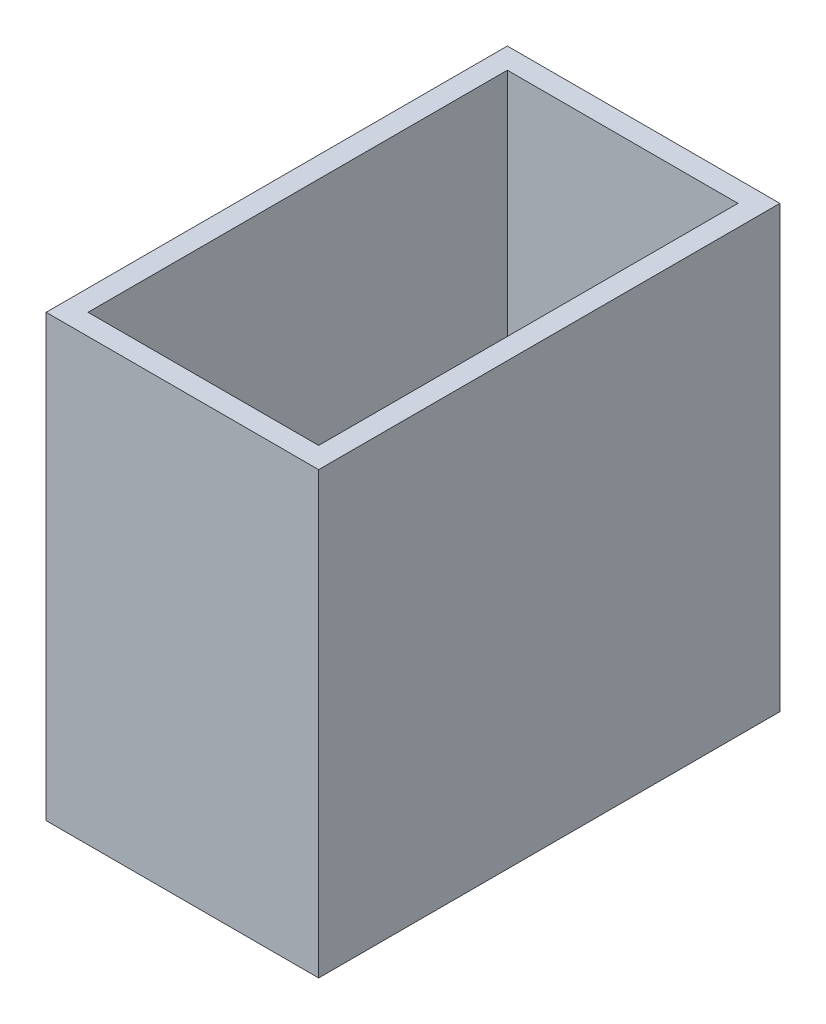
ISO-10303-21;
HEADER;
FILE_DESCRIPTION(('STEP AP214'),'2;1');
FILE_NAME('part.step','',(''),(''),'','','');
FILE_SCHEMA(('AUTOMOTIVE_DESIGN { 1 0 10303 214 1 1 1 1 }'));
ENDSEC;
DATA;
#1=APPLICATION_CONTEXT('core data for automotive mechanical design processes');
#2=APPLICATION_PROTOCOL_DEFINITION('international standard','automotive_design',2000,#1);
#3=PRODUCT_CONTEXT('',#1,'mechanical');
#4=PRODUCT('Part','Part','',(#3));
#5=PRODUCT_RELATED_PRODUCT_CATEGORY('part','',(#4));
#6=PRODUCT_DEFINITION_FORMATION('','',#4);
#7=PRODUCT_DEFINITION_CONTEXT('part definition',#1,'design');
#8=PRODUCT_DEFINITION('design','',#6,#7);
#9=PRODUCT_DEFINITION_SHAPE('','',#8);
#10=(LENGTH_UNIT() NAMED_UNIT(*) SI_UNIT(.MILLI.,.METRE.));
#11=(NAMED_UNIT(*) PLANE_ANGLE_UNIT() SI_UNIT($,.RADIAN.));
#12=(NAMED_UNIT(*) SI_UNIT($,.STERADIAN.) SOLID_ANGLE_UNIT());
#13=UNCERTAINTY_MEASURE_WITH_UNIT(LENGTH_MEASURE(1.E-05),#10,'distance_accuracy_value','');
#14=(GEOMETRIC_REPRESENTATION_CONTEXT(3) GLOBAL_UNCERTAINTY_ASSIGNED_CONTEXT((#13)) GLOBAL_UNIT_ASSIGNED_CONTEXT((#10,
#11,#12)) REPRESENTATION_CONTEXT('',''));
#15=CARTESIAN_POINT('',(0.,0.,0.));
#16=DIRECTION('',(0.,0.,1.));
#17=DIRECTION('',(1.,0.,0.));
#18=AXIS2_PLACEMENT_3D('',#15,#16,#17);
#19=CARTESIAN_POINT('',(-13.,2.,-22.));
#20=DIRECTION('',(1.,0.,0.));
#21=DIRECTION('',(0.,0.,-1.));
#22=AXIS2_PLACEMENT_3D('',#19,#20,#21);
#23=PLANE('',#22);
#24=DIRECTION('',(0.,0.,1.));
#25=VECTOR('',#24,1.);
#26=CARTESIAN_POINT('',(-13.,0.,-22.));
#27=LINE('',#26,#25);
#28=CARTESIAN_POINT('',(-13.,0.,-22.));
#29=VERTEX_POINT('',#28);
#30=CARTESIAN_POINT('',(-13.,0.,22.));
#31=VERTEX_POINT('',#30);
#32=EDGE_CURVE('E150',#29,#31,#27,.T.);
#33=ORIENTED_EDGE('',*,*,#32,.T.);
#34=DIRECTION('',(0.,-1.,0.));
#35=VECTOR('',#34,1.);
#36=CARTESIAN_POINT('',(-13.,2.,22.));
#37=LINE('',#36,#35);
#38=CARTESIAN_POINT('',(-13.,42.,22.));
#39=VERTEX_POINT('',#38);
#40=EDGE_CURVE('E11',#39,#31,#37,.T.);
#41=ORIENTED_EDGE('',*,*,#40,.F.);
#42=DIRECTION('',(0.,0.,1.));
#43=VECTOR('',#42,1.);
#44=CARTESIAN_POINT('',(-13.,42.,22.));
#45=LINE('',#44,#43);
#46=CARTESIAN_POINT('',(-13.,42.,-22.));
#47=VERTEX_POINT('',#46);
#48=EDGE_CURVE('E115',#47,#39,#45,.T.);
#49=ORIENTED_EDGE('',*,*,#48,.F.);
#50=DIRECTION('',(0.,-1.,0.));
#51=VECTOR('',#50,1.);
#52=CARTESIAN_POINT('',(-13.,2.,-22.));
#53=LINE('',#52,#51);
#54=EDGE_CURVE('E158',#47,#29,#53,.T.);
#55=ORIENTED_EDGE('',*,*,#54,.T.);
#56=EDGE_LOOP('',(#33,#41,#49,#55));
#57=FACE_BOUND('',#56,.T.);
#58=ADVANCED_FACE('F33',(#57),#23,.F.);
#59=CARTESIAN_POINT('',(13.,2.,22.));
#60=DIRECTION('',(0.,0.,-1.));
#61=DIRECTION('',(-1.,0.,0.));
#62=AXIS2_PLACEMENT_3D('',#59,#60,#61);
#63=PLANE('',#62);
#64=DIRECTION('',(1.,0.,0.));
#65=VECTOR('',#64,1.);
#66=CARTESIAN_POINT('',(13.,0.,22.));
#67=LINE('',#66,#65);
#68=CARTESIAN_POINT('',(13.,0.,22.));
#69=VERTEX_POINT('',#68);
#70=EDGE_CURVE('E153',#31,#69,#67,.T.);
#71=ORIENTED_EDGE('',*,*,#70,.T.);
#72=DIRECTION('',(0.,-1.,0.));
#73=VECTOR('',#72,1.);
#74=CARTESIAN_POINT('',(13.,2.,22.));
#75=LINE('',#74,#73);
#76=CARTESIAN_POINT('',(13.,42.,22.));
#77=VERTEX_POINT('',#76);
#78=EDGE_CURVE('E40',#77,#69,#75,.T.);
#79=ORIENTED_EDGE('',*,*,#78,.F.);
#80=DIRECTION('',(1.,0.,0.));
#81=VECTOR('',#80,1.);
#82=CARTESIAN_POINT('',(13.,42.,22.));
#83=LINE('',#82,#81);
#84=EDGE_CURVE('E141',#39,#77,#83,.T.);
#85=ORIENTED_EDGE('',*,*,#84,.F.);
#86=ORIENTED_EDGE('',*,*,#40,.T.);
#87=EDGE_LOOP('',(#71,#79,#85,#86));
#88=FACE_BOUND('',#87,.T.);
#89=ADVANCED_FACE('F176',(#88),#63,.F.);
#90=CARTESIAN_POINT('',(13.,2.,-22.));
#91=DIRECTION('',(-1.,0.,0.));
#92=DIRECTION('',(0.,0.,1.));
#93=AXIS2_PLACEMENT_3D('',#90,#91,#92);
#94=PLANE('',#93);
#95=DIRECTION('',(0.,0.,-1.));
#96=VECTOR('',#95,1.);
#97=CARTESIAN_POINT('',(13.,0.,-22.));
#98=LINE('',#97,#96);
#99=CARTESIAN_POINT('',(13.,0.,-22.));
#100=VERTEX_POINT('',#99);
#101=EDGE_CURVE('E155',#69,#100,#98,.T.);
#102=ORIENTED_EDGE('',*,*,#101,.T.);
#103=DIRECTION('',(0.,-1.,0.));
#104=VECTOR('',#103,1.);
#105=CARTESIAN_POINT('',(13.,2.,-22.));
#106=LINE('',#105,#104);
#107=CARTESIAN_POINT('',(13.,42.,-22.));
#108=VERTEX_POINT('',#107);
#109=EDGE_CURVE('E160',#108,#100,#106,.T.);
#110=ORIENTED_EDGE('',*,*,#109,.F.);
#111=DIRECTION('',(0.,0.,-1.));
#112=VECTOR('',#111,1.);
#113=CARTESIAN_POINT('',(13.,42.,22.));
#114=LINE('',#113,#112);
#115=EDGE_CURVE('E144',#77,#108,#114,.T.);
#116=ORIENTED_EDGE('',*,*,#115,.F.);
#117=ORIENTED_EDGE('',*,*,#78,.T.);
#118=EDGE_LOOP('',(#102,#110,#116,#117));
#119=FACE_BOUND('',#118,.T.);
#120=ADVANCED_FACE('F165',(#119),#94,.F.);
#121=CARTESIAN_POINT('',(13.,2.,-22.));
#122=DIRECTION('',(0.,0.,1.));
#123=DIRECTION('',(1.,0.,0.));
#124=AXIS2_PLACEMENT_3D('',#121,#122,#123);
#125=PLANE('',#124);
#126=DIRECTION('',(-1.,0.,0.));
#127=VECTOR('',#126,1.);
#128=CARTESIAN_POINT('',(13.,0.,-22.));
#129=LINE('',#128,#127);
#130=EDGE_CURVE('E55',#100,#29,#129,.T.);
#131=ORIENTED_EDGE('',*,*,#130,.T.);
#132=ORIENTED_EDGE('',*,*,#54,.F.);
#133=DIRECTION('',(-1.,0.,0.));
#134=VECTOR('',#133,1.);
#135=CARTESIAN_POINT('',(13.,42.,-22.));
#136=LINE('',#135,#134);
#137=EDGE_CURVE('E147',#108,#47,#136,.T.);
#138=ORIENTED_EDGE('',*,*,#137,.F.);
#139=ORIENTED_EDGE('',*,*,#109,.T.);
#140=EDGE_LOOP('',(#131,#132,#138,#139));
#141=FACE_BOUND('',#140,.T.);
#142=ADVANCED_FACE('F174',(#141),#125,.F.);
#143=CARTESIAN_POINT('',(0.,0.,0.));
#144=DIRECTION('',(0.,-1.,0.));
#145=DIRECTION('',(0.,0.,-1.));
#146=AXIS2_PLACEMENT_3D('',#143,#144,#145);
#147=PLANE('',#146);
#148=ORIENTED_EDGE('',*,*,#32,.F.);
#149=ORIENTED_EDGE('',*,*,#130,.F.);
#150=ORIENTED_EDGE('',*,*,#101,.F.);
#151=ORIENTED_EDGE('',*,*,#70,.F.);
#152=EDGE_LOOP('',(#148,#149,#150,#151));
#153=FACE_BOUND('',#152,.T.);
#154=ADVANCED_FACE('F170',(#153),#147,.T.);
#155=CARTESIAN_POINT('',(0.,42.,0.));
#156=DIRECTION('',(0.,1.,0.));
#157=DIRECTION('',(0.,0.,1.));
#158=AXIS2_PLACEMENT_3D('',#155,#156,#157);
#159=PLANE('',#158);
#160=ORIENTED_EDGE('',*,*,#48,.T.);
#161=ORIENTED_EDGE('',*,*,#84,.T.);
#162=ORIENTED_EDGE('',*,*,#115,.T.);
#163=ORIENTED_EDGE('',*,*,#137,.T.);
#164=EDGE_LOOP('',(#160,#161,#162,#163));
#165=FACE_BOUND('',#164,.T.);
#166=DIRECTION('',(1.,0.,0.));
#167=VECTOR('',#166,1.);
#168=CARTESIAN_POINT('',(11.,42.,20.));
#169=LINE('',#168,#167);
#170=CARTESIAN_POINT('',(-11.,42.,20.));
#171=VERTEX_POINT('',#170);
#172=CARTESIAN_POINT('',(11.,42.,20.));
#173=VERTEX_POINT('',#172);
#174=EDGE_CURVE('E107',#171,#173,#169,.T.);
#175=ORIENTED_EDGE('',*,*,#174,.F.);
#176=DIRECTION('',(0.,0.,1.));
#177=VECTOR('',#176,1.);
#178=CARTESIAN_POINT('',(-11.,42.,-20.));
#179=LINE('',#178,#177);
#180=CARTESIAN_POINT('',(-11.,42.,-20.));
#181=VERTEX_POINT('',#180);
#182=EDGE_CURVE('E99',#181,#171,#179,.T.);
#183=ORIENTED_EDGE('',*,*,#182,.F.);
#184=DIRECTION('',(-1.,0.,0.));
#185=VECTOR('',#184,1.);
#186=CARTESIAN_POINT('',(11.,42.,-20.));
#187=LINE('',#186,#185);
#188=CARTESIAN_POINT('',(11.,42.,-20.));
#189=VERTEX_POINT('',#188);
#190=EDGE_CURVE('E123',#189,#181,#187,.T.);
#191=ORIENTED_EDGE('',*,*,#190,.F.);
#192=DIRECTION('',(0.,0.,-1.));
#193=VECTOR('',#192,1.);
#194=CARTESIAN_POINT('',(11.,42.,-20.));
#195=LINE('',#194,#193);
#196=EDGE_CURVE('E121',#173,#189,#195,.T.);
#197=ORIENTED_EDGE('',*,*,#196,.F.);
#198=EDGE_LOOP('',(#175,#183,#191,#197));
#199=FACE_BOUND('',#198,.T.);
#200=ADVANCED_FACE('F119',(#165,#199),#159,.T.);
#201=CARTESIAN_POINT('',(-11.,42.,-20.));
#202=DIRECTION('',(1.,0.,0.));
#203=DIRECTION('',(0.,0.,-1.));
#204=AXIS2_PLACEMENT_3D('',#201,#202,#203);
#205=PLANE('',#204);
#206=DIRECTION('',(0.,0.,1.));
#207=VECTOR('',#206,1.);
#208=CARTESIAN_POINT('',(-11.,2.,-20.));
#209=LINE('',#208,#207);
#210=CARTESIAN_POINT('',(-11.,2.,-20.));
#211=VERTEX_POINT('',#210);
#212=CARTESIAN_POINT('',(-11.,2.,20.));
#213=VERTEX_POINT('',#212);
#214=EDGE_CURVE('E127',#211,#213,#209,.T.);
#215=ORIENTED_EDGE('',*,*,#214,.F.);
#216=DIRECTION('',(0.,-1.,0.));
#217=VECTOR('',#216,1.);
#218=CARTESIAN_POINT('',(-11.,42.,-20.));
#219=LINE('',#218,#217);
#220=EDGE_CURVE('E47',#181,#211,#219,.T.);
#221=ORIENTED_EDGE('',*,*,#220,.F.);
#222=ORIENTED_EDGE('',*,*,#182,.T.);
#223=DIRECTION('',(0.,-1.,0.));
#224=VECTOR('',#223,1.);
#225=CARTESIAN_POINT('',(-11.,42.,20.));
#226=LINE('',#225,#224);
#227=EDGE_CURVE('E102',#171,#213,#226,.T.);
#228=ORIENTED_EDGE('',*,*,#227,.T.);
#229=EDGE_LOOP('',(#215,#221,#222,#228));
#230=FACE_BOUND('',#229,.T.);
#231=ADVANCED_FACE('F101',(#230),#205,.T.);
#232=CARTESIAN_POINT('',(11.,42.,20.));
#233=DIRECTION('',(0.,0.,-1.));
#234=DIRECTION('',(-1.,0.,0.));
#235=AXIS2_PLACEMENT_3D('',#232,#233,#234);
#236=PLANE('',#235);
#237=DIRECTION('',(1.,0.,0.));
#238=VECTOR('',#237,1.);
#239=CARTESIAN_POINT('',(11.,2.,20.));
#240=LINE('',#239,#238);
#241=CARTESIAN_POINT('',(11.,2.,20.));
#242=VERTEX_POINT('',#241);
#243=EDGE_CURVE('E114',#213,#242,#240,.T.);
#244=ORIENTED_EDGE('',*,*,#243,.F.);
#245=ORIENTED_EDGE('',*,*,#227,.F.);
#246=ORIENTED_EDGE('',*,*,#174,.T.);
#247=DIRECTION('',(0.,-1.,0.));
#248=VECTOR('',#247,1.);
#249=CARTESIAN_POINT('',(11.,42.,20.));
#250=LINE('',#249,#248);
#251=EDGE_CURVE('E116',#173,#242,#250,.T.);
#252=ORIENTED_EDGE('',*,*,#251,.T.);
#253=EDGE_LOOP('',(#244,#245,#246,#252));
#254=FACE_BOUND('',#253,.T.);
#255=ADVANCED_FACE('F111',(#254),#236,.T.);
#256=CARTESIAN_POINT('',(11.,42.,-20.));
#257=DIRECTION('',(-1.,0.,0.));
#258=DIRECTION('',(0.,0.,1.));
#259=AXIS2_PLACEMENT_3D('',#256,#257,#258);
#260=PLANE('',#259);
#261=DIRECTION('',(0.,0.,-1.));
#262=VECTOR('',#261,1.);
#263=CARTESIAN_POINT('',(11.,2.,-20.));
#264=LINE('',#263,#262);
#265=CARTESIAN_POINT('',(11.,2.,-20.));
#266=VERTEX_POINT('',#265);
#267=EDGE_CURVE('E130',#242,#266,#264,.T.);
#268=ORIENTED_EDGE('',*,*,#267,.F.);
#269=ORIENTED_EDGE('',*,*,#251,.F.);
#270=ORIENTED_EDGE('',*,*,#196,.T.);
#271=DIRECTION('',(0.,-1.,0.));
#272=VECTOR('',#271,1.);
#273=CARTESIAN_POINT('',(11.,42.,-20.));
#274=LINE('',#273,#272);
#275=EDGE_CURVE('E136',#189,#266,#274,.T.);
#276=ORIENTED_EDGE('',*,*,#275,.T.);
#277=EDGE_LOOP('',(#268,#269,#270,#276));
#278=FACE_BOUND('',#277,.T.);
#279=ADVANCED_FACE('F199',(#278),#260,.T.);
#280=CARTESIAN_POINT('',(11.,42.,-20.));
#281=DIRECTION('',(0.,0.,1.));
#282=DIRECTION('',(1.,0.,0.));
#283=AXIS2_PLACEMENT_3D('',#280,#281,#282);
#284=PLANE('',#283);
#285=DIRECTION('',(-1.,0.,0.));
#286=VECTOR('',#285,1.);
#287=CARTESIAN_POINT('',(11.,2.,-20.));
#288=LINE('',#287,#286);
#289=EDGE_CURVE('E108',#266,#211,#288,.T.);
#290=ORIENTED_EDGE('',*,*,#289,.F.);
#291=ORIENTED_EDGE('',*,*,#275,.F.);
#292=ORIENTED_EDGE('',*,*,#190,.T.);
#293=ORIENTED_EDGE('',*,*,#220,.T.);
#294=EDGE_LOOP('',(#290,#291,#292,#293));
#295=FACE_BOUND('',#294,.T.);
#296=ADVANCED_FACE('F191',(#295),#284,.T.);
#297=CARTESIAN_POINT('',(0.,2.,0.));
#298=DIRECTION('',(0.,-1.,0.));
#299=DIRECTION('',(0.,0.,-1.));
#300=AXIS2_PLACEMENT_3D('',#297,#298,#299);
#301=PLANE('',#300);
#302=ORIENTED_EDGE('',*,*,#289,.T.);
#303=ORIENTED_EDGE('',*,*,#214,.T.);
#304=ORIENTED_EDGE('',*,*,#243,.T.);
#305=ORIENTED_EDGE('',*,*,#267,.T.);
#306=EDGE_LOOP('',(#302,#303,#304,#305));
#307=FACE_BOUND('',#306,.T.);
#308=ADVANCED_FACE('F188',(#307),#301,.F.);
#309=CLOSED_SHELL('',(#58,#89,#120,#142,#154,#200,#231,#255,#279,#296,#308));
#310=MANIFOLD_SOLID_BREP('B2',#309);
#311=ADVANCED_BREP_SHAPE_REPRESENTATION('',(#18,#310),#14);
#312=SHAPE_DEFINITION_REPRESENTATION(#9,#311);
ENDSEC;
END-ISO-10303-21;
